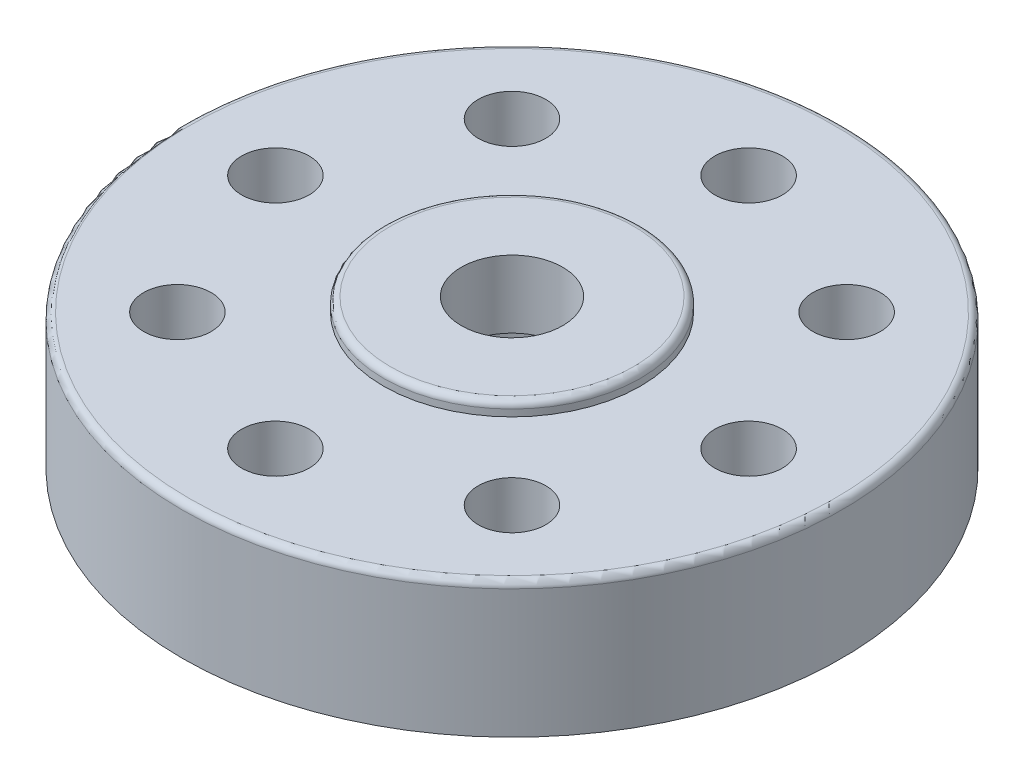
ISO-10303-21;
HEADER;
FILE_DESCRIPTION(('STEP AP214'),'2;1');
FILE_NAME('part.step','',(''),(''),'','','');
FILE_SCHEMA(('AUTOMOTIVE_DESIGN { 1 0 10303 214 1 1 1 1 }'));
ENDSEC;
DATA;
#1=APPLICATION_CONTEXT('core data for automotive mechanical design processes');
#2=APPLICATION_PROTOCOL_DEFINITION('international standard','automotive_design',2000,#1);
#3=PRODUCT_CONTEXT('',#1,'mechanical');
#4=PRODUCT('Part','Part','',(#3));
#5=PRODUCT_RELATED_PRODUCT_CATEGORY('part','',(#4));
#6=PRODUCT_DEFINITION_FORMATION('','',#4);
#7=PRODUCT_DEFINITION_CONTEXT('part definition',#1,'design');
#8=PRODUCT_DEFINITION('design','',#6,#7);
#9=PRODUCT_DEFINITION_SHAPE('','',#8);
#10=(LENGTH_UNIT() NAMED_UNIT(*) SI_UNIT(.MILLI.,.METRE.));
#11=(NAMED_UNIT(*) PLANE_ANGLE_UNIT() SI_UNIT($,.RADIAN.));
#12=(NAMED_UNIT(*) SI_UNIT($,.STERADIAN.) SOLID_ANGLE_UNIT());
#13=UNCERTAINTY_MEASURE_WITH_UNIT(LENGTH_MEASURE(1.E-05),#10,'distance_accuracy_value','');
#14=(GEOMETRIC_REPRESENTATION_CONTEXT(3) GLOBAL_UNCERTAINTY_ASSIGNED_CONTEXT((#13)) GLOBAL_UNIT_ASSIGNED_CONTEXT((#10,
#11,#12)) REPRESENTATION_CONTEXT('',''));
#15=CARTESIAN_POINT('',(0.,0.,0.));
#16=DIRECTION('',(0.,0.,1.));
#17=DIRECTION('',(1.,0.,0.));
#18=AXIS2_PLACEMENT_3D('',#15,#16,#17);
#19=CARTESIAN_POINT('',(0.,4.4,0.));
#20=DIRECTION('',(0.,1.,0.));
#21=DIRECTION('',(0.,0.,1.));
#22=AXIS2_PLACEMENT_3D('',#19,#20,#21);
#23=PLANE('',#22);
#24=CARTESIAN_POINT('',(0.,4.4,0.));
#25=DIRECTION('',(0.,1.,0.));
#26=DIRECTION('',(0.,0.,1.));
#27=AXIS2_PLACEMENT_3D('',#24,#25,#26);
#28=CIRCLE('',#27,1.5);
#29=CARTESIAN_POINT('',(0.,4.4,1.5));
#30=VERTEX_POINT('',#29);
#31=EDGE_CURVE('E18',#30,#30,#28,.F.);
#32=ORIENTED_EDGE('',*,*,#31,.T.);
#33=EDGE_LOOP('',(#32));
#34=FACE_BOUND('',#33,.T.);
#35=CARTESIAN_POINT('',(0.,4.4,0.));
#36=DIRECTION('',(0.,-1.,0.));
#37=DIRECTION('',(0.,0.,1.));
#38=AXIS2_PLACEMENT_3D('',#35,#36,#37);
#39=CIRCLE('',#38,3.6);
#40=CARTESIAN_POINT('',(0.,4.4,3.6));
#41=VERTEX_POINT('',#40);
#42=EDGE_CURVE('E99',#41,#41,#39,.T.);
#43=ORIENTED_EDGE('',*,*,#42,.F.);
#44=EDGE_LOOP('',(#43));
#45=FACE_BOUND('',#44,.T.);
#46=ADVANCED_FACE('F14',(#34,#45),#23,.T.);
#47=CARTESIAN_POINT('',(0.,4.2,0.));
#48=DIRECTION('',(0.,1.,0.));
#49=DIRECTION('',(0.,0.,1.));
#50=AXIS2_PLACEMENT_3D('',#47,#48,#49);
#51=TOROIDAL_SURFACE('',#50,3.6,0.2);
#52=ORIENTED_EDGE('',*,*,#42,.T.);
#53=EDGE_LOOP('',(#52));
#54=FACE_BOUND('',#53,.T.);
#55=CARTESIAN_POINT('',(0.,4.2,0.));
#56=DIRECTION('',(0.,-1.,0.));
#57=DIRECTION('',(0.,0.,-1.));
#58=AXIS2_PLACEMENT_3D('',#55,#56,#57);
#59=CIRCLE('',#58,3.8);
#60=CARTESIAN_POINT('',(0.,4.2,-3.8));
#61=VERTEX_POINT('',#60);
#62=EDGE_CURVE('E90',#61,#61,#59,.T.);
#63=ORIENTED_EDGE('',*,*,#62,.F.);
#64=EDGE_LOOP('',(#63));
#65=FACE_BOUND('',#64,.T.);
#66=ADVANCED_FACE('F133',(#54,#65),#51,.T.);
#67=CARTESIAN_POINT('',(0.,2.4,0.));
#68=DIRECTION('',(0.,1.,0.));
#69=DIRECTION('',(0.,0.,1.));
#70=AXIS2_PLACEMENT_3D('',#67,#68,#69);
#71=CYLINDRICAL_SURFACE('',#70,1.5);
#72=ORIENTED_EDGE('',*,*,#31,.F.);
#73=EDGE_LOOP('',(#72));
#74=FACE_BOUND('',#73,.T.);
#75=CARTESIAN_POINT('',(0.,2.4,0.));
#76=DIRECTION('',(0.,1.,0.));
#77=DIRECTION('',(0.,0.,1.));
#78=AXIS2_PLACEMENT_3D('',#75,#76,#77);
#79=CIRCLE('',#78,1.5);
#80=CARTESIAN_POINT('',(0.,2.4,1.5));
#81=VERTEX_POINT('',#80);
#82=EDGE_CURVE('E88',#81,#81,#79,.F.);
#83=ORIENTED_EDGE('',*,*,#82,.T.);
#84=EDGE_LOOP('',(#83));
#85=FACE_BOUND('',#84,.T.);
#86=ADVANCED_FACE('F130',(#74,#85),#71,.F.);
#87=CARTESIAN_POINT('',(0.,4.4,0.));
#88=DIRECTION('',(0.,-1.,0.));
#89=DIRECTION('',(0.,0.,-1.));
#90=AXIS2_PLACEMENT_3D('',#87,#88,#89);
#91=CYLINDRICAL_SURFACE('',#90,3.8);
#92=CARTESIAN_POINT('',(0.,4.,0.));
#93=DIRECTION('',(0.,-1.,0.));
#94=DIRECTION('',(0.,0.,-1.));
#95=AXIS2_PLACEMENT_3D('',#92,#93,#94);
#96=CIRCLE('',#95,3.8);
#97=CARTESIAN_POINT('',(0.,4.,-3.8));
#98=VERTEX_POINT('',#97);
#99=EDGE_CURVE('E85',#98,#98,#96,.T.);
#100=ORIENTED_EDGE('',*,*,#99,.F.);
#101=EDGE_LOOP('',(#100));
#102=FACE_BOUND('',#101,.T.);
#103=ORIENTED_EDGE('',*,*,#62,.T.);
#104=EDGE_LOOP('',(#103));
#105=FACE_BOUND('',#104,.T.);
#106=ADVANCED_FACE('F126',(#102,#105),#91,.T.);
#107=CARTESIAN_POINT('',(0.,3.8,0.));
#108=DIRECTION('',(0.,1.,0.));
#109=DIRECTION('',(0.,0.,1.));
#110=AXIS2_PLACEMENT_3D('',#107,#108,#109);
#111=TOROIDAL_SURFACE('',#110,9.55,0.2);
#112=CARTESIAN_POINT('',(0.,4.,0.));
#113=DIRECTION('',(0.,-1.,0.));
#114=DIRECTION('',(0.,0.,1.));
#115=AXIS2_PLACEMENT_3D('',#112,#113,#114);
#116=CIRCLE('',#115,9.55);
#117=CARTESIAN_POINT('',(0.,4.,9.55));
#118=VERTEX_POINT('',#117);
#119=EDGE_CURVE('E87',#118,#118,#116,.F.);
#120=ORIENTED_EDGE('',*,*,#119,.F.);
#121=EDGE_LOOP('',(#120));
#122=FACE_BOUND('',#121,.T.);
#123=CARTESIAN_POINT('',(0.,3.8,0.));
#124=DIRECTION('',(0.,-1.,0.));
#125=DIRECTION('',(0.,0.,-1.));
#126=AXIS2_PLACEMENT_3D('',#123,#124,#125);
#127=CIRCLE('',#126,9.75);
#128=CARTESIAN_POINT('',(0.,3.8,-9.75));
#129=VERTEX_POINT('',#128);
#130=EDGE_CURVE('E72',#129,#129,#127,.T.);
#131=ORIENTED_EDGE('',*,*,#130,.F.);
#132=EDGE_LOOP('',(#131));
#133=FACE_BOUND('',#132,.T.);
#134=ADVANCED_FACE('F115',(#122,#133),#111,.T.);
#135=CARTESIAN_POINT('',(0.,2.4,0.));
#136=DIRECTION('',(0.,1.,0.));
#137=DIRECTION('',(0.,0.,1.));
#138=AXIS2_PLACEMENT_3D('',#135,#136,#137);
#139=PLANE('',#138);
#140=CARTESIAN_POINT('',(0.,2.4,0.));
#141=DIRECTION('',(0.,-1.,0.));
#142=DIRECTION('',(0.,0.,-1.));
#143=AXIS2_PLACEMENT_3D('',#140,#141,#142);
#144=CIRCLE('',#143,2.75);
#145=CARTESIAN_POINT('',(0.,2.4,-2.75));
#146=VERTEX_POINT('',#145);
#147=EDGE_CURVE('E69',#146,#146,#144,.T.);
#148=ORIENTED_EDGE('',*,*,#147,.T.);
#149=EDGE_LOOP('',(#148));
#150=FACE_BOUND('',#149,.T.);
#151=ORIENTED_EDGE('',*,*,#82,.F.);
#152=EDGE_LOOP('',(#151));
#153=FACE_BOUND('',#152,.T.);
#154=ADVANCED_FACE('F125',(#150,#153),#139,.F.);
#155=CARTESIAN_POINT('',(0.,4.,0.));
#156=DIRECTION('',(0.,1.,0.));
#157=DIRECTION('',(0.,0.,1.));
#158=AXIS2_PLACEMENT_3D('',#155,#156,#157);
#159=PLANE('',#158);
#160=ORIENTED_EDGE('',*,*,#99,.T.);
#161=EDGE_LOOP('',(#160));
#162=FACE_BOUND('',#161,.T.);
#163=CARTESIAN_POINT('',(0.,4.,-7.));
#164=DIRECTION('',(0.,-1.,0.));
#165=DIRECTION('',(0.,0.,-1.));
#166=AXIS2_PLACEMENT_3D('',#163,#164,#165);
#167=CIRCLE('',#166,1.);
#168=CARTESIAN_POINT('',(0.,4.,-8.));
#169=VERTEX_POINT('',#168);
#170=EDGE_CURVE('E82',#169,#169,#167,.T.);
#171=ORIENTED_EDGE('',*,*,#170,.T.);
#172=EDGE_LOOP('',(#171));
#173=FACE_BOUND('',#172,.T.);
#174=CARTESIAN_POINT('',(-7.,4.,0.));
#175=DIRECTION('',(0.,-1.,0.));
#176=DIRECTION('',(0.,0.,-1.));
#177=AXIS2_PLACEMENT_3D('',#174,#175,#176);
#178=CIRCLE('',#177,1.);
#179=CARTESIAN_POINT('',(-7.,4.,-1.00000000000005));
#180=VERTEX_POINT('',#179);
#181=EDGE_CURVE('E79',#180,#180,#178,.T.);
#182=ORIENTED_EDGE('',*,*,#181,.T.);
#183=EDGE_LOOP('',(#182));
#184=FACE_BOUND('',#183,.T.);
#185=CARTESIAN_POINT('',(0.,4.,7.));
#186=DIRECTION('',(0.,-1.,0.));
#187=DIRECTION('',(0.,0.,-1.));
#188=AXIS2_PLACEMENT_3D('',#185,#186,#187);
#189=CIRCLE('',#188,1.);
#190=CARTESIAN_POINT('',(0.,4.,6.));
#191=VERTEX_POINT('',#190);
#192=EDGE_CURVE('E76',#191,#191,#189,.T.);
#193=ORIENTED_EDGE('',*,*,#192,.T.);
#194=EDGE_LOOP('',(#193));
#195=FACE_BOUND('',#194,.T.);
#196=CARTESIAN_POINT('',(7.,4.,0.));
#197=DIRECTION('',(0.,-1.,0.));
#198=DIRECTION('',(0.,0.,-1.));
#199=AXIS2_PLACEMENT_3D('',#196,#197,#198);
#200=CIRCLE('',#199,1.);
#201=CARTESIAN_POINT('',(7.,4.,-1.));
#202=VERTEX_POINT('',#201);
#203=EDGE_CURVE('E73',#202,#202,#200,.T.);
#204=ORIENTED_EDGE('',*,*,#203,.T.);
#205=EDGE_LOOP('',(#204));
#206=FACE_BOUND('',#205,.T.);
#207=CARTESIAN_POINT('',(4.94974746830582,4.,4.94974746830584));
#208=DIRECTION('',(0.,-1.,0.));
#209=DIRECTION('',(0.,0.,-1.));
#210=AXIS2_PLACEMENT_3D('',#207,#208,#209);
#211=CIRCLE('',#210,1.);
#212=CARTESIAN_POINT('',(4.94974746830582,4.,3.94974746830584));
#213=VERTEX_POINT('',#212);
#214=EDGE_CURVE('E66',#213,#213,#211,.T.);
#215=ORIENTED_EDGE('',*,*,#214,.T.);
#216=EDGE_LOOP('',(#215));
#217=FACE_BOUND('',#216,.T.);
#218=CARTESIAN_POINT('',(-4.94974746830586,4.,4.94974746830581));
#219=DIRECTION('',(0.,-1.,0.));
#220=DIRECTION('',(0.,0.,-1.));
#221=AXIS2_PLACEMENT_3D('',#218,#219,#220);
#222=CIRCLE('',#221,1.);
#223=CARTESIAN_POINT('',(-4.94974746830586,4.,3.9497474683058));
#224=VERTEX_POINT('',#223);
#225=EDGE_CURVE('E63',#224,#224,#222,.T.);
#226=ORIENTED_EDGE('',*,*,#225,.T.);
#227=EDGE_LOOP('',(#226));
#228=FACE_BOUND('',#227,.T.);
#229=CARTESIAN_POINT('',(-4.94974746830579,4.,-4.94974746830588));
#230=DIRECTION('',(0.,-1.,0.));
#231=DIRECTION('',(0.,0.,-1.));
#232=AXIS2_PLACEMENT_3D('',#229,#230,#231);
#233=CIRCLE('',#232,1.);
#234=CARTESIAN_POINT('',(-4.94974746830579,4.,-5.94974746830588));
#235=VERTEX_POINT('',#234);
#236=EDGE_CURVE('E60',#235,#235,#233,.T.);
#237=ORIENTED_EDGE('',*,*,#236,.T.);
#238=EDGE_LOOP('',(#237));
#239=FACE_BOUND('',#238,.T.);
#240=CARTESIAN_POINT('',(4.94974746830589,4.,-4.94974746830577));
#241=DIRECTION('',(0.,-1.,0.));
#242=DIRECTION('',(0.,0.,-1.));
#243=AXIS2_PLACEMENT_3D('',#240,#241,#242);
#244=CIRCLE('',#243,1.);
#245=CARTESIAN_POINT('',(4.94974746830589,4.,-5.94974746830577));
#246=VERTEX_POINT('',#245);
#247=EDGE_CURVE('E57',#246,#246,#244,.T.);
#248=ORIENTED_EDGE('',*,*,#247,.T.);
#249=EDGE_LOOP('',(#248));
#250=FACE_BOUND('',#249,.T.);
#251=ORIENTED_EDGE('',*,*,#119,.T.);
#252=EDGE_LOOP('',(#251));
#253=FACE_BOUND('',#252,.T.);
#254=ADVANCED_FACE('F190',(#162,#173,#184,#195,#206,#217,#228,#239,#250,#253),#159,.T.);
#255=CARTESIAN_POINT('',(0.,4.,-7.));
#256=DIRECTION('',(0.,-1.,0.));
#257=DIRECTION('',(0.,0.,-1.));
#258=AXIS2_PLACEMENT_3D('',#255,#256,#257);
#259=CYLINDRICAL_SURFACE('',#258,1.);
#260=CARTESIAN_POINT('',(0.,0.,-7.));
#261=DIRECTION('',(0.,-1.,0.));
#262=DIRECTION('',(0.,0.,-1.));
#263=AXIS2_PLACEMENT_3D('',#260,#261,#262);
#264=CIRCLE('',#263,1.);
#265=CARTESIAN_POINT('',(0.,0.,-8.));
#266=VERTEX_POINT('',#265);
#267=EDGE_CURVE('E54',#266,#266,#264,.T.);
#268=ORIENTED_EDGE('',*,*,#267,.T.);
#269=EDGE_LOOP('',(#268));
#270=FACE_BOUND('',#269,.T.);
#271=ORIENTED_EDGE('',*,*,#170,.F.);
#272=EDGE_LOOP('',(#271));
#273=FACE_BOUND('',#272,.T.);
#274=ADVANCED_FACE('F187',(#270,#273),#259,.F.);
#275=CARTESIAN_POINT('',(-7.,4.,0.));
#276=DIRECTION('',(0.,-1.,0.));
#277=DIRECTION('',(0.,0.,-1.));
#278=AXIS2_PLACEMENT_3D('',#275,#276,#277);
#279=CYLINDRICAL_SURFACE('',#278,1.);
#280=CARTESIAN_POINT('',(-7.,0.,0.));
#281=DIRECTION('',(0.,-1.,0.));
#282=DIRECTION('',(0.,0.,-1.));
#283=AXIS2_PLACEMENT_3D('',#280,#281,#282);
#284=CIRCLE('',#283,1.);
#285=CARTESIAN_POINT('',(-7.,0.,-1.00000000000005));
#286=VERTEX_POINT('',#285);
#287=EDGE_CURVE('E51',#286,#286,#284,.T.);
#288=ORIENTED_EDGE('',*,*,#287,.T.);
#289=EDGE_LOOP('',(#288));
#290=FACE_BOUND('',#289,.T.);
#291=ORIENTED_EDGE('',*,*,#181,.F.);
#292=EDGE_LOOP('',(#291));
#293=FACE_BOUND('',#292,.T.);
#294=ADVANCED_FACE('F183',(#290,#293),#279,.F.);
#295=CARTESIAN_POINT('',(0.,4.,7.));
#296=DIRECTION('',(0.,-1.,0.));
#297=DIRECTION('',(0.,0.,-1.));
#298=AXIS2_PLACEMENT_3D('',#295,#296,#297);
#299=CYLINDRICAL_SURFACE('',#298,1.);
#300=CARTESIAN_POINT('',(0.,0.,7.));
#301=DIRECTION('',(0.,-1.,0.));
#302=DIRECTION('',(0.,0.,-1.));
#303=AXIS2_PLACEMENT_3D('',#300,#301,#302);
#304=CIRCLE('',#303,1.);
#305=CARTESIAN_POINT('',(0.,0.,6.));
#306=VERTEX_POINT('',#305);
#307=EDGE_CURVE('E48',#306,#306,#304,.T.);
#308=ORIENTED_EDGE('',*,*,#307,.T.);
#309=EDGE_LOOP('',(#308));
#310=FACE_BOUND('',#309,.T.);
#311=ORIENTED_EDGE('',*,*,#192,.F.);
#312=EDGE_LOOP('',(#311));
#313=FACE_BOUND('',#312,.T.);
#314=ADVANCED_FACE('F179',(#310,#313),#299,.F.);
#315=CARTESIAN_POINT('',(7.,4.,0.));
#316=DIRECTION('',(0.,-1.,0.));
#317=DIRECTION('',(0.,0.,-1.));
#318=AXIS2_PLACEMENT_3D('',#315,#316,#317);
#319=CYLINDRICAL_SURFACE('',#318,1.);
#320=CARTESIAN_POINT('',(7.,0.,0.));
#321=DIRECTION('',(0.,-1.,0.));
#322=DIRECTION('',(0.,0.,-1.));
#323=AXIS2_PLACEMENT_3D('',#320,#321,#322);
#324=CIRCLE('',#323,1.);
#325=CARTESIAN_POINT('',(7.,0.,-1.));
#326=VERTEX_POINT('',#325);
#327=EDGE_CURVE('E45',#326,#326,#324,.T.);
#328=ORIENTED_EDGE('',*,*,#327,.T.);
#329=EDGE_LOOP('',(#328));
#330=FACE_BOUND('',#329,.T.);
#331=ORIENTED_EDGE('',*,*,#203,.F.);
#332=EDGE_LOOP('',(#331));
#333=FACE_BOUND('',#332,.T.);
#334=ADVANCED_FACE('F175',(#330,#333),#319,.F.);
#335=CARTESIAN_POINT('',(0.,4.,0.));
#336=DIRECTION('',(0.,-1.,0.));
#337=DIRECTION('',(0.,0.,-1.));
#338=AXIS2_PLACEMENT_3D('',#335,#336,#337);
#339=CYLINDRICAL_SURFACE('',#338,9.75);
#340=CARTESIAN_POINT('',(0.,0.,0.));
#341=DIRECTION('',(0.,-1.,0.));
#342=DIRECTION('',(0.,0.,-1.));
#343=AXIS2_PLACEMENT_3D('',#340,#341,#342);
#344=CIRCLE('',#343,9.75);
#345=CARTESIAN_POINT('',(0.,0.,-9.75));
#346=VERTEX_POINT('',#345);
#347=EDGE_CURVE('E42',#346,#346,#344,.F.);
#348=ORIENTED_EDGE('',*,*,#347,.T.);
#349=EDGE_LOOP('',(#348));
#350=FACE_BOUND('',#349,.T.);
#351=ORIENTED_EDGE('',*,*,#130,.T.);
#352=EDGE_LOOP('',(#351));
#353=FACE_BOUND('',#352,.T.);
#354=ADVANCED_FACE('F171',(#350,#353),#339,.T.);
#355=CARTESIAN_POINT('',(0.,4.,0.));
#356=DIRECTION('',(0.,-1.,0.));
#357=DIRECTION('',(0.,0.,-1.));
#358=AXIS2_PLACEMENT_3D('',#355,#356,#357);
#359=CYLINDRICAL_SURFACE('',#358,2.75);
#360=ORIENTED_EDGE('',*,*,#147,.F.);
#361=EDGE_LOOP('',(#360));
#362=FACE_BOUND('',#361,.T.);
#363=CARTESIAN_POINT('',(0.,0.,0.));
#364=DIRECTION('',(0.,-1.,0.));
#365=DIRECTION('',(0.,0.,-1.));
#366=AXIS2_PLACEMENT_3D('',#363,#364,#365);
#367=CIRCLE('',#366,2.75);
#368=CARTESIAN_POINT('',(0.,0.,-2.75));
#369=VERTEX_POINT('',#368);
#370=EDGE_CURVE('E39',#369,#369,#367,.T.);
#371=ORIENTED_EDGE('',*,*,#370,.T.);
#372=EDGE_LOOP('',(#371));
#373=FACE_BOUND('',#372,.T.);
#374=ADVANCED_FACE('F167',(#362,#373),#359,.F.);
#375=CARTESIAN_POINT('',(4.94974746830582,4.,4.94974746830584));
#376=DIRECTION('',(0.,-1.,0.));
#377=DIRECTION('',(0.,0.,-1.));
#378=AXIS2_PLACEMENT_3D('',#375,#376,#377);
#379=CYLINDRICAL_SURFACE('',#378,1.);
#380=CARTESIAN_POINT('',(4.94974746830582,0.,4.94974746830584));
#381=DIRECTION('',(0.,-1.,0.));
#382=DIRECTION('',(0.,0.,-1.));
#383=AXIS2_PLACEMENT_3D('',#380,#381,#382);
#384=CIRCLE('',#383,1.);
#385=CARTESIAN_POINT('',(4.94974746830582,0.,3.94974746830584));
#386=VERTEX_POINT('',#385);
#387=EDGE_CURVE('E36',#386,#386,#384,.T.);
#388=ORIENTED_EDGE('',*,*,#387,.T.);
#389=EDGE_LOOP('',(#388));
#390=FACE_BOUND('',#389,.T.);
#391=ORIENTED_EDGE('',*,*,#214,.F.);
#392=EDGE_LOOP('',(#391));
#393=FACE_BOUND('',#392,.T.);
#394=ADVANCED_FACE('F163',(#390,#393),#379,.F.);
#395=CARTESIAN_POINT('',(-4.94974746830586,4.,4.94974746830581));
#396=DIRECTION('',(0.,-1.,0.));
#397=DIRECTION('',(0.,0.,-1.));
#398=AXIS2_PLACEMENT_3D('',#395,#396,#397);
#399=CYLINDRICAL_SURFACE('',#398,1.);
#400=CARTESIAN_POINT('',(-4.94974746830586,0.,4.94974746830581));
#401=DIRECTION('',(0.,-1.,0.));
#402=DIRECTION('',(0.,0.,-1.));
#403=AXIS2_PLACEMENT_3D('',#400,#401,#402);
#404=CIRCLE('',#403,1.);
#405=CARTESIAN_POINT('',(-4.94974746830586,0.,3.9497474683058));
#406=VERTEX_POINT('',#405);
#407=EDGE_CURVE('E27',#406,#406,#404,.T.);
#408=ORIENTED_EDGE('',*,*,#407,.T.);
#409=EDGE_LOOP('',(#408));
#410=FACE_BOUND('',#409,.T.);
#411=ORIENTED_EDGE('',*,*,#225,.F.);
#412=EDGE_LOOP('',(#411));
#413=FACE_BOUND('',#412,.T.);
#414=ADVANCED_FACE('F159',(#410,#413),#399,.F.);
#415=CARTESIAN_POINT('',(-4.94974746830579,4.,-4.94974746830588));
#416=DIRECTION('',(0.,-1.,0.));
#417=DIRECTION('',(0.,0.,-1.));
#418=AXIS2_PLACEMENT_3D('',#415,#416,#417);
#419=CYLINDRICAL_SURFACE('',#418,1.);
#420=CARTESIAN_POINT('',(-4.94974746830579,0.,-4.94974746830588));
#421=DIRECTION('',(0.,-1.,0.));
#422=DIRECTION('',(0.,0.,-1.));
#423=AXIS2_PLACEMENT_3D('',#420,#421,#422);
#424=CIRCLE('',#423,1.);
#425=CARTESIAN_POINT('',(-4.94974746830579,0.,-5.94974746830588));
#426=VERTEX_POINT('',#425);
#427=EDGE_CURVE('E22',#426,#426,#424,.T.);
#428=ORIENTED_EDGE('',*,*,#427,.T.);
#429=EDGE_LOOP('',(#428));
#430=FACE_BOUND('',#429,.T.);
#431=ORIENTED_EDGE('',*,*,#236,.F.);
#432=EDGE_LOOP('',(#431));
#433=FACE_BOUND('',#432,.T.);
#434=ADVANCED_FACE('F153',(#430,#433),#419,.F.);
#435=CARTESIAN_POINT('',(4.94974746830589,4.,-4.94974746830577));
#436=DIRECTION('',(0.,-1.,0.));
#437=DIRECTION('',(0.,0.,-1.));
#438=AXIS2_PLACEMENT_3D('',#435,#436,#437);
#439=CYLINDRICAL_SURFACE('',#438,1.);
#440=CARTESIAN_POINT('',(4.94974746830589,0.,-4.94974746830577));
#441=DIRECTION('',(0.,-1.,0.));
#442=DIRECTION('',(0.,0.,-1.));
#443=AXIS2_PLACEMENT_3D('',#440,#441,#442);
#444=CIRCLE('',#443,1.);
#445=CARTESIAN_POINT('',(4.94974746830589,0.,-5.94974746830577));
#446=VERTEX_POINT('',#445);
#447=EDGE_CURVE('E10',#446,#446,#444,.T.);
#448=ORIENTED_EDGE('',*,*,#447,.T.);
#449=EDGE_LOOP('',(#448));
#450=FACE_BOUND('',#449,.T.);
#451=ORIENTED_EDGE('',*,*,#247,.F.);
#452=EDGE_LOOP('',(#451));
#453=FACE_BOUND('',#452,.T.);
#454=ADVANCED_FACE('F147',(#450,#453),#439,.F.);
#455=CARTESIAN_POINT('',(0.,0.,0.));
#456=DIRECTION('',(0.,1.,0.));
#457=DIRECTION('',(0.,0.,1.));
#458=AXIS2_PLACEMENT_3D('',#455,#456,#457);
#459=PLANE('',#458);
#460=ORIENTED_EDGE('',*,*,#447,.F.);
#461=EDGE_LOOP('',(#460));
#462=FACE_BOUND('',#461,.T.);
#463=ORIENTED_EDGE('',*,*,#427,.F.);
#464=EDGE_LOOP('',(#463));
#465=FACE_BOUND('',#464,.T.);
#466=ORIENTED_EDGE('',*,*,#407,.F.);
#467=EDGE_LOOP('',(#466));
#468=FACE_BOUND('',#467,.T.);
#469=ORIENTED_EDGE('',*,*,#387,.F.);
#470=EDGE_LOOP('',(#469));
#471=FACE_BOUND('',#470,.T.);
#472=ORIENTED_EDGE('',*,*,#370,.F.);
#473=EDGE_LOOP('',(#472));
#474=FACE_BOUND('',#473,.T.);
#475=ORIENTED_EDGE('',*,*,#347,.F.);
#476=EDGE_LOOP('',(#475));
#477=FACE_BOUND('',#476,.T.);
#478=ORIENTED_EDGE('',*,*,#327,.F.);
#479=EDGE_LOOP('',(#478));
#480=FACE_BOUND('',#479,.T.);
#481=ORIENTED_EDGE('',*,*,#307,.F.);
#482=EDGE_LOOP('',(#481));
#483=FACE_BOUND('',#482,.T.);
#484=ORIENTED_EDGE('',*,*,#287,.F.);
#485=EDGE_LOOP('',(#484));
#486=FACE_BOUND('',#485,.T.);
#487=ORIENTED_EDGE('',*,*,#267,.F.);
#488=EDGE_LOOP('',(#487));
#489=FACE_BOUND('',#488,.T.);
#490=ADVANCED_FACE('F145',(#462,#465,#468,#471,#474,#477,#480,#483,#486,#489),#459,.F.);
#491=CLOSED_SHELL('',(#46,#66,#86,#106,#134,#154,#254,#274,#294,#314,#334,#354,#374,#394,#414,
#434,#454,#490));
#492=MANIFOLD_SOLID_BREP('B1',#491);
#493=ADVANCED_BREP_SHAPE_REPRESENTATION('',(#18,#492),#14);
#494=SHAPE_DEFINITION_REPRESENTATION(#9,#493);
ENDSEC;
END-ISO-10303-21;
